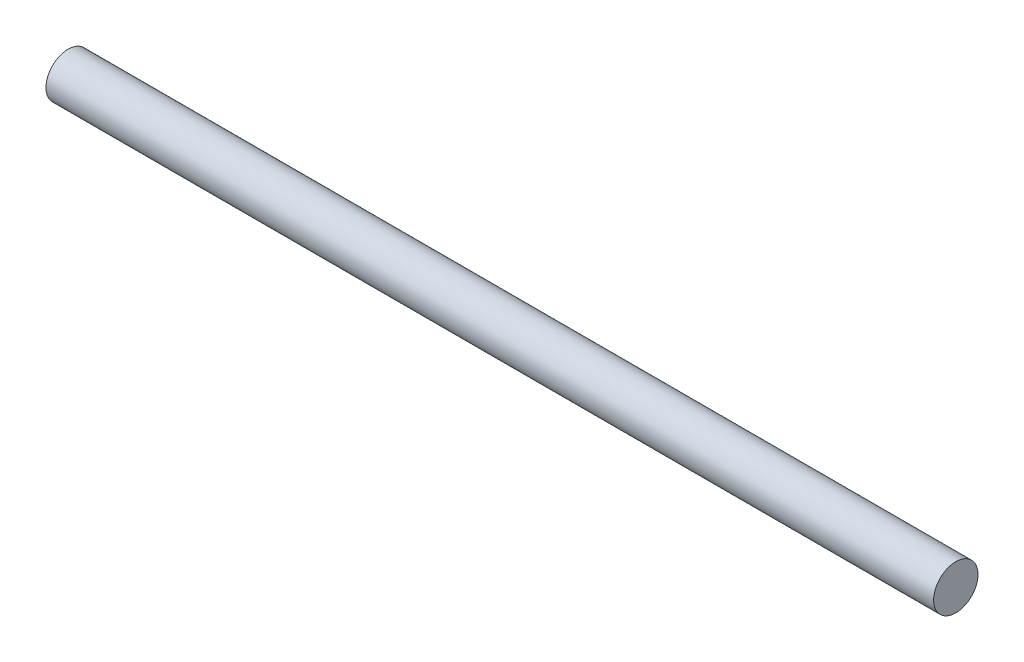
ISO-10303-21;
HEADER;
FILE_DESCRIPTION(('STEP AP214'),'2;1');
FILE_NAME('part.step','',(''),(''),'','','');
FILE_SCHEMA(('AUTOMOTIVE_DESIGN { 1 0 10303 214 1 1 1 1 }'));
ENDSEC;
DATA;
#1=APPLICATION_CONTEXT('core data for automotive mechanical design processes');
#2=APPLICATION_PROTOCOL_DEFINITION('international standard','automotive_design',2000,#1);
#3=PRODUCT_CONTEXT('',#1,'mechanical');
#4=PRODUCT('Part','Part','',(#3));
#5=PRODUCT_RELATED_PRODUCT_CATEGORY('part','',(#4));
#6=PRODUCT_DEFINITION_FORMATION('','',#4);
#7=PRODUCT_DEFINITION_CONTEXT('part definition',#1,'design');
#8=PRODUCT_DEFINITION('design','',#6,#7);
#9=PRODUCT_DEFINITION_SHAPE('','',#8);
#10=(LENGTH_UNIT() NAMED_UNIT(*) SI_UNIT(.MILLI.,.METRE.));
#11=(NAMED_UNIT(*) PLANE_ANGLE_UNIT() SI_UNIT($,.RADIAN.));
#12=(NAMED_UNIT(*) SI_UNIT($,.STERADIAN.) SOLID_ANGLE_UNIT());
#13=UNCERTAINTY_MEASURE_WITH_UNIT(LENGTH_MEASURE(1.E-05),#10,'distance_accuracy_value','');
#14=(GEOMETRIC_REPRESENTATION_CONTEXT(3) GLOBAL_UNCERTAINTY_ASSIGNED_CONTEXT((#13)) GLOBAL_UNIT_ASSIGNED_CONTEXT((#10,
#11,#12)) REPRESENTATION_CONTEXT('',''));
#15=CARTESIAN_POINT('',(0.,0.,0.));
#16=DIRECTION('',(0.,0.,1.));
#17=DIRECTION('',(1.,0.,0.));
#18=AXIS2_PLACEMENT_3D('',#15,#16,#17);
#19=CARTESIAN_POINT('',(63.5,0.,0.));
#20=DIRECTION('',(-1.,0.,0.));
#21=DIRECTION('',(0.,0.,1.));
#22=AXIS2_PLACEMENT_3D('',#19,#20,#21);
#23=CYLINDRICAL_SURFACE('',#22,3.175);
#24=CARTESIAN_POINT('',(63.5,0.,0.));
#25=DIRECTION('',(1.,0.,0.));
#26=DIRECTION('',(0.,0.,-1.));
#27=AXIS2_PLACEMENT_3D('',#24,#25,#26);
#28=CIRCLE('',#27,3.175);
#29=CARTESIAN_POINT('',(63.5,0.,-3.175));
#30=VERTEX_POINT('',#29);
#31=EDGE_CURVE('E10',#30,#30,#28,.T.);
#32=ORIENTED_EDGE('',*,*,#31,.F.);
#33=EDGE_LOOP('',(#32));
#34=FACE_BOUND('',#33,.T.);
#35=CARTESIAN_POINT('',(-63.5,0.,0.));
#36=DIRECTION('',(1.,0.,0.));
#37=DIRECTION('',(0.,0.,-1.));
#38=AXIS2_PLACEMENT_3D('',#35,#36,#37);
#39=CIRCLE('',#38,3.175);
#40=CARTESIAN_POINT('',(-63.5,0.,-3.175));
#41=VERTEX_POINT('',#40);
#42=EDGE_CURVE('E34',#41,#41,#39,.T.);
#43=ORIENTED_EDGE('',*,*,#42,.T.);
#44=EDGE_LOOP('',(#43));
#45=FACE_BOUND('',#44,.T.);
#46=ADVANCED_FACE('F31',(#34,#45),#23,.T.);
#47=CARTESIAN_POINT('',(63.5,0.,0.));
#48=DIRECTION('',(1.,0.,0.));
#49=DIRECTION('',(0.,0.,-1.));
#50=AXIS2_PLACEMENT_3D('',#47,#48,#49);
#51=PLANE('',#50);
#52=ORIENTED_EDGE('',*,*,#31,.T.);
#53=EDGE_LOOP('',(#52));
#54=FACE_BOUND('',#53,.T.);
#55=ADVANCED_FACE('F46',(#54),#51,.T.);
#56=CARTESIAN_POINT('',(-63.5,0.,0.));
#57=DIRECTION('',(1.,0.,0.));
#58=DIRECTION('',(0.,0.,-1.));
#59=AXIS2_PLACEMENT_3D('',#56,#57,#58);
#60=PLANE('',#59);
#61=ORIENTED_EDGE('',*,*,#42,.F.);
#62=EDGE_LOOP('',(#61));
#63=FACE_BOUND('',#62,.T.);
#64=ADVANCED_FACE('F44',(#63),#60,.F.);
#65=CLOSED_SHELL('',(#46,#55,#64));
#66=MANIFOLD_SOLID_BREP('B2',#65);
#67=ADVANCED_BREP_SHAPE_REPRESENTATION('',(#18,#66),#14);
#68=SHAPE_DEFINITION_REPRESENTATION(#9,#67);
ENDSEC;
END-ISO-10303-21;
